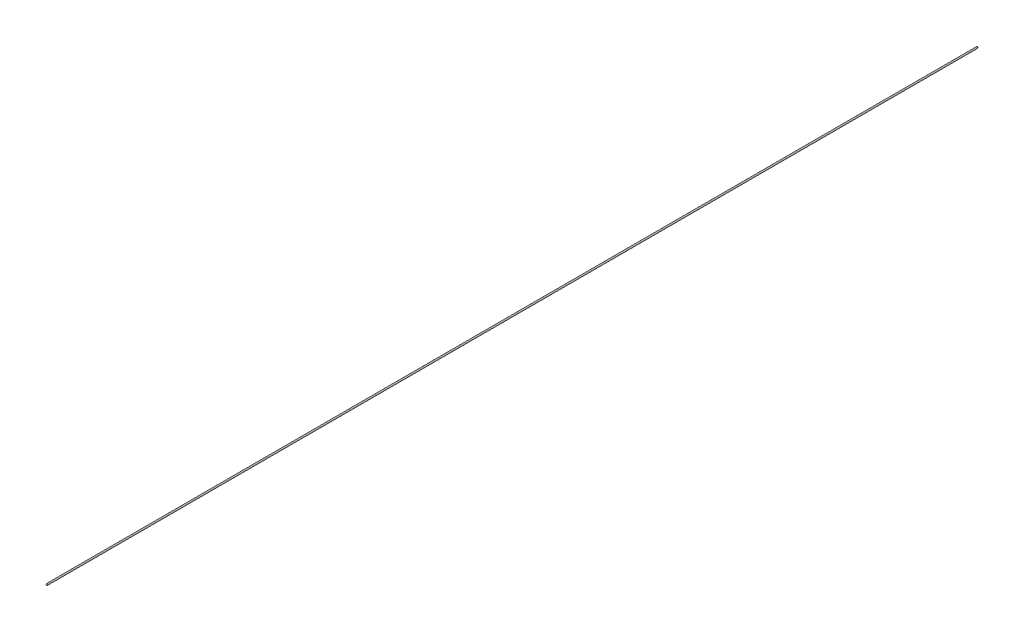
ISO-10303-21;
HEADER;
FILE_DESCRIPTION(('STEP AP214'),'2;1');
FILE_NAME('part.step','',(''),(''),'','','');
FILE_SCHEMA(('AUTOMOTIVE_DESIGN { 1 0 10303 214 1 1 1 1 }'));
ENDSEC;
DATA;
#1=APPLICATION_CONTEXT('core data for automotive mechanical design processes');
#2=APPLICATION_PROTOCOL_DEFINITION('international standard','automotive_design',2000,#1);
#3=PRODUCT_CONTEXT('',#1,'mechanical');
#4=PRODUCT('Part','Part','',(#3));
#5=PRODUCT_RELATED_PRODUCT_CATEGORY('part','',(#4));
#6=PRODUCT_DEFINITION_FORMATION('','',#4);
#7=PRODUCT_DEFINITION_CONTEXT('part definition',#1,'design');
#8=PRODUCT_DEFINITION('design','',#6,#7);
#9=PRODUCT_DEFINITION_SHAPE('','',#8);
#10=(LENGTH_UNIT() NAMED_UNIT(*) SI_UNIT(.MILLI.,.METRE.));
#11=(NAMED_UNIT(*) PLANE_ANGLE_UNIT() SI_UNIT($,.RADIAN.));
#12=(NAMED_UNIT(*) SI_UNIT($,.STERADIAN.) SOLID_ANGLE_UNIT());
#13=UNCERTAINTY_MEASURE_WITH_UNIT(LENGTH_MEASURE(1.E-05),#10,'distance_accuracy_value','');
#14=(GEOMETRIC_REPRESENTATION_CONTEXT(3) GLOBAL_UNCERTAINTY_ASSIGNED_CONTEXT((#13)) GLOBAL_UNIT_ASSIGNED_CONTEXT((#10,
#11,#12)) REPRESENTATION_CONTEXT('',''));
#15=CARTESIAN_POINT('',(0.,0.,0.));
#16=DIRECTION('',(0.,0.,1.));
#17=DIRECTION('',(1.,0.,0.));
#18=AXIS2_PLACEMENT_3D('',#15,#16,#17);
#19=CARTESIAN_POINT('',(0.,0.,31100.));
#20=DIRECTION('',(0.,0.,-1.));
#21=DIRECTION('',(-1.,0.,0.));
#22=AXIS2_PLACEMENT_3D('',#19,#20,#21);
#23=CYLINDRICAL_SURFACE('',#22,25.);
#24=CARTESIAN_POINT('',(0.,0.,31100.));
#25=DIRECTION('',(0.,0.,1.));
#26=DIRECTION('',(1.,0.,0.));
#27=AXIS2_PLACEMENT_3D('',#24,#25,#26);
#28=CIRCLE('',#27,25.);
#29=CARTESIAN_POINT('',(25.,0.,31100.));
#30=VERTEX_POINT('',#29);
#31=EDGE_CURVE('E10',#30,#30,#28,.T.);
#32=ORIENTED_EDGE('',*,*,#31,.F.);
#33=EDGE_LOOP('',(#32));
#34=FACE_BOUND('',#33,.T.);
#35=CARTESIAN_POINT('',(0.,0.,0.));
#36=DIRECTION('',(0.,0.,-1.));
#37=DIRECTION('',(0.,1.,0.));
#38=AXIS2_PLACEMENT_3D('',#35,#36,#37);
#39=CIRCLE('',#38,25.);
#40=CARTESIAN_POINT('',(0.,25.,0.));
#41=VERTEX_POINT('',#40);
#42=EDGE_CURVE('E38',#41,#41,#39,.T.);
#43=ORIENTED_EDGE('',*,*,#42,.F.);
#44=EDGE_LOOP('',(#43));
#45=FACE_BOUND('',#44,.T.);
#46=ADVANCED_FACE('F32',(#34,#45),#23,.T.);
#47=CARTESIAN_POINT('',(0.,0.,31100.));
#48=DIRECTION('',(0.,0.,1.));
#49=DIRECTION('',(0.,1.,0.));
#50=AXIS2_PLACEMENT_3D('',#47,#48,#49);
#51=SPHERICAL_SURFACE('',#50,24.9999999999993);
#52=ORIENTED_EDGE('',*,*,#31,.T.);
#53=EDGE_LOOP('',(#52));
#54=FACE_BOUND('',#53,.T.);
#55=ADVANCED_FACE('F47',(#54),#51,.T.);
#56=CARTESIAN_POINT('',(0.,0.,0.));
#57=DIRECTION('',(0.,0.,-1.));
#58=DIRECTION('',(0.,-1.,0.));
#59=AXIS2_PLACEMENT_3D('',#56,#57,#58);
#60=SPHERICAL_SURFACE('',#59,25.);
#61=ORIENTED_EDGE('',*,*,#42,.T.);
#62=EDGE_LOOP('',(#61));
#63=FACE_BOUND('',#62,.T.);
#64=ADVANCED_FACE('F44',(#63),#60,.T.);
#65=CLOSED_SHELL('',(#46,#55,#64));
#66=MANIFOLD_SOLID_BREP('B2',#65);
#67=ADVANCED_BREP_SHAPE_REPRESENTATION('',(#18,#66),#14);
#68=SHAPE_DEFINITION_REPRESENTATION(#9,#67);
ENDSEC;
END-ISO-10303-21;
